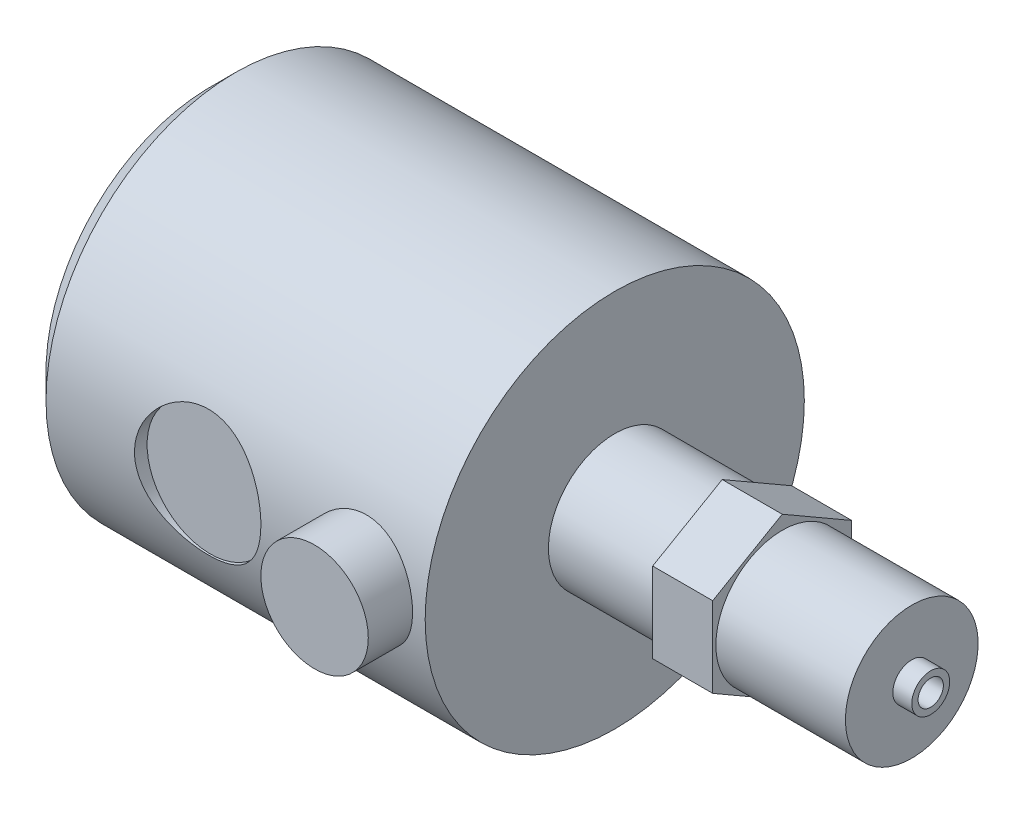
ISO-10303-21;
HEADER;
FILE_DESCRIPTION(('STEP AP214'),'2;1');
FILE_NAME('part.step','',(''),(''),'','','');
FILE_SCHEMA(('AUTOMOTIVE_DESIGN { 1 0 10303 214 1 1 1 1 }'));
ENDSEC;
DATA;
#1=APPLICATION_CONTEXT('core data for automotive mechanical design processes');
#2=APPLICATION_PROTOCOL_DEFINITION('international standard','automotive_design',2000,#1);
#3=PRODUCT_CONTEXT('',#1,'mechanical');
#4=PRODUCT('Part','Part','',(#3));
#5=PRODUCT_RELATED_PRODUCT_CATEGORY('part','',(#4));
#6=PRODUCT_DEFINITION_FORMATION('','',#4);
#7=PRODUCT_DEFINITION_CONTEXT('part definition',#1,'design');
#8=PRODUCT_DEFINITION('design','',#6,#7);
#9=PRODUCT_DEFINITION_SHAPE('','',#8);
#10=(LENGTH_UNIT() NAMED_UNIT(*) SI_UNIT(.MILLI.,.METRE.));
#11=(NAMED_UNIT(*) PLANE_ANGLE_UNIT() SI_UNIT($,.RADIAN.));
#12=(NAMED_UNIT(*) SI_UNIT($,.STERADIAN.) SOLID_ANGLE_UNIT());
#13=UNCERTAINTY_MEASURE_WITH_UNIT(LENGTH_MEASURE(1.E-05),#10,'distance_accuracy_value','');
#14=(GEOMETRIC_REPRESENTATION_CONTEXT(3) GLOBAL_UNCERTAINTY_ASSIGNED_CONTEXT((#13)) GLOBAL_UNIT_ASSIGNED_CONTEXT((#10,
#11,#12)) REPRESENTATION_CONTEXT('',''));
#15=CARTESIAN_POINT('',(0.,0.,0.));
#16=DIRECTION('',(0.,0.,1.));
#17=DIRECTION('',(1.,0.,0.));
#18=AXIS2_PLACEMENT_3D('',#15,#16,#17);
#19=CARTESIAN_POINT('',(0.,0.,0.));
#20=DIRECTION('',(-1.,0.,0.));
#21=DIRECTION('',(0.,0.,1.));
#22=AXIS2_PLACEMENT_3D('',#19,#20,#21);
#23=CYLINDRICAL_SURFACE('',#22,30.);
#24=CARTESIAN_POINT('',(38.,0.,30.));
#25=CARTESIAN_POINT('',(38.0000001104679,-0.272817421855649,30.0000000727974));
#26=CARTESIAN_POINT('',(37.9888266523667,-0.545633217756683,29.9962700139409));
#27=CARTESIAN_POINT('',(37.9442413958574,-1.08923625252841,29.9814525321439));
#28=CARTESIAN_POINT('',(37.9108297781762,-1.36002350786673,29.9703651689954));
#29=CARTESIAN_POINT('',(37.8220822374092,-1.89761112302447,29.9411347007489));
#30=CARTESIAN_POINT('',(37.7667446109079,-2.16441117140915,29.922991047455));
#31=CARTESIAN_POINT('',(37.6346518387313,-2.69211184449215,29.8801375011105));
#32=CARTESIAN_POINT('',(37.5578965476063,-2.95301242911357,29.8554275634677));
#33=CARTESIAN_POINT('',(37.3838026740723,-3.46664728525619,29.8001502927581));
#34=CARTESIAN_POINT('',(37.2865034902221,-3.71939613546444,29.769594181714));
#35=CARTESIAN_POINT('',(37.0719867410987,-4.2157054038381,29.7033758431392));
#36=CARTESIAN_POINT('',(36.9547618038682,-4.45926238037108,29.6677117265642));
#37=CARTESIAN_POINT('',(36.7013132201959,-4.93557741320288,29.5921987127881));
#38=CARTESIAN_POINT('',(36.5650906781184,-5.16833609617821,29.5523500588748));
#39=CARTESIAN_POINT('',(36.2745905228092,-5.62171195987547,29.4694667799179));
#40=CARTESIAN_POINT('',(36.1203118241659,-5.84232840951691,29.4264319634014));
#41=CARTESIAN_POINT('',(35.7896247247178,-6.27682953459762,29.3368734013662));
#42=CARTESIAN_POINT('',(35.6126759880062,-6.49028930660538,29.2902826885599));
#43=CARTESIAN_POINT('',(35.2417996008254,-6.90166928730258,29.1960870485027));
#44=CARTESIAN_POINT('',(35.0478716671758,-7.09958923671303,29.1484821043462));
#45=CARTESIAN_POINT('',(34.644187198448,-7.47873453607431,29.0535150777194));
#46=CARTESIAN_POINT('',(34.4344270648865,-7.65995606974809,29.0061530530903));
#47=CARTESIAN_POINT('',(34.0003833013844,-8.00450980543821,28.9129673550339));
#48=CARTESIAN_POINT('',(33.7761000429094,-8.16784246472039,28.8671436423059));
#49=CARTESIAN_POINT('',(33.307627620987,-8.48001162237398,28.7770145745701));
#50=CARTESIAN_POINT('',(33.0630494088315,-8.62828897719031,28.7327920322828));
#51=CARTESIAN_POINT('',(32.561607951453,-8.90356690608016,28.6486860707732));
#52=CARTESIAN_POINT('',(32.3047496061247,-9.0305758768566,28.6088009413422));
#53=CARTESIAN_POINT('',(31.7803993366107,-9.26232893823766,28.534611919855));
#54=CARTESIAN_POINT('',(31.5129077165079,-9.36707366499655,28.5003078683376));
#55=CARTESIAN_POINT('',(30.9692040524567,-9.55334459189202,28.4384115850147));
#56=CARTESIAN_POINT('',(30.692992401599,-9.63487183699472,28.4108190511471));
#57=CARTESIAN_POINT('',(30.1433639211935,-9.77156399073686,28.3640896180245));
#58=CARTESIAN_POINT('',(29.8701664913575,-9.82752458111659,28.3446991444855));
#59=CARTESIAN_POINT('',(29.319617177656,-9.91646893957756,28.3137046439995));
#60=CARTESIAN_POINT('',(29.042265380201,-9.94945318488936,28.3021004553276));
#61=CARTESIAN_POINT('',(28.4856273063419,-9.99210001297699,28.2870721491151));
#62=CARTESIAN_POINT('',(28.2063415667797,-10.001768826595,28.2836458461098));
#63=CARTESIAN_POINT('',(27.6479662400752,-9.99770051099412,28.2850842635986));
#64=CARTESIAN_POINT('',(27.3688766476204,-9.98396404222416,28.2899487501436));
#65=CARTESIAN_POINT('',(26.8258185571162,-9.93439524598055,28.3073918779751));
#66=CARTESIAN_POINT('',(26.5617426267179,-9.89960301642488,28.319607253905));
#67=CARTESIAN_POINT('',(26.0376215889632,-9.80916853998117,28.3510582066347));
#68=CARTESIAN_POINT('',(25.777576340707,-9.7535270236365,28.3702935374598));
#69=CARTESIAN_POINT('',(25.2632912481491,-9.62189570023088,28.4152063218622));
#70=CARTESIAN_POINT('',(25.009050859133,-9.54590781101341,28.4408831682495));
#71=CARTESIAN_POINT('',(24.5078880967364,-9.37418519909552,28.4979443617719));
#72=CARTESIAN_POINT('',(24.2609685440672,-9.27844297530628,28.529330876437));
#73=CARTESIAN_POINT('',(23.772237067919,-9.0663166164916,28.5974561704828));
#74=CARTESIAN_POINT('',(23.5305664167003,-8.94963170239518,28.6342713183779));
#75=CARTESIAN_POINT('',(23.0577897989686,-8.69749161241992,28.7118622802787));
#76=CARTESIAN_POINT('',(22.8266874781259,-8.56203002330162,28.7526394460964));
#77=CARTESIAN_POINT('',(22.3764378067254,-8.27327503440926,28.8370515032613));
#78=CARTESIAN_POINT('',(22.1572912822404,-8.11998040476689,28.8806865916162));
#79=CARTESIAN_POINT('',(21.7321864753289,-7.79652835236897,28.9696785669952));
#80=CARTESIAN_POINT('',(21.5262286466316,-7.62637034997736,29.0150355131707));
#81=CARTESIAN_POINT('',(21.1182174584067,-7.26085153575986,29.1087179470551));
#82=CARTESIAN_POINT('',(20.9169351310576,-7.06463704194718,29.1570743820817));
#83=CARTESIAN_POINT('',(20.531580418041,-6.65594240213112,29.2530762745549));
#84=CARTESIAN_POINT('',(20.3475026290649,-6.44346740133943,29.300721951247));
#85=CARTESIAN_POINT('',(19.997608072022,-6.00339730644672,29.3940440756636));
#86=CARTESIAN_POINT('',(19.8318000348253,-5.77579506581797,29.4397195755768));
#87=CARTESIAN_POINT('',(19.5197728737227,-5.30706897712641,29.5278149211553));
#88=CARTESIAN_POINT('',(19.3735459990738,-5.06595053306834,29.5702360521294));
#89=CARTESIAN_POINT('',(19.1003243634992,-4.56913058063748,29.6510879634885));
#90=CARTESIAN_POINT('',(18.9735405213375,-4.31330561219176,29.6894737298341));
#91=CARTESIAN_POINT('',(18.7420713564707,-3.79108523456436,29.7606637721347));
#92=CARTESIAN_POINT('',(18.6373863166824,-3.5246896901062,29.7934679766314));
#93=CARTESIAN_POINT('',(18.4510885271493,-2.98332200960532,29.8525359450835));
#94=CARTESIAN_POINT('',(18.3694692782669,-2.70835231375461,29.8788015511394));
#95=CARTESIAN_POINT('',(18.2300560036121,-2.15185145897869,29.92402797464));
#96=CARTESIAN_POINT('',(18.1722608812851,-1.87032060267474,29.9429891282845));
#97=CARTESIAN_POINT('',(18.0830583762764,-1.31523069421226,29.9723879768698));
#98=CARTESIAN_POINT('',(18.050615367746,-1.04185537514999,29.9831596368278));
#99=CARTESIAN_POINT('',(18.0083792858962,-0.493170936320485,29.9972012675858));
#100=CARTESIAN_POINT('',(17.9985855570884,-0.217861872748686,30.0004714554843));
#101=CARTESIAN_POINT('',(18.0017433831611,0.332568031007716,29.9994188985649));
#102=CARTESIAN_POINT('',(18.0146915114979,0.60768889330079,29.9950972976112));
#103=CARTESIAN_POINT('',(18.0631992209163,1.15570622136199,29.9789840848464));
#104=CARTESIAN_POINT('',(18.0987585736551,1.4286027095651,29.9671925484717));
#105=CARTESIAN_POINT('',(18.1907787821032,1.96222703239709,29.9369169558084));
#106=CARTESIAN_POINT('',(18.2465987120614,2.22307746287106,29.9186384657949));
#107=CARTESIAN_POINT('',(18.3787575509438,2.7390974709425,29.8758162932983));
#108=CARTESIAN_POINT('',(18.4551037635981,2.99426499136465,29.8512703808768));
#109=CARTESIAN_POINT('',(18.627646328962,3.4970874059583,29.7965488926633));
#110=CARTESIAN_POINT('',(18.7238370604955,3.74474440483059,29.7663749113147));
#111=CARTESIAN_POINT('',(18.9353702712062,4.2311771288961,29.7011345010077));
#112=CARTESIAN_POINT('',(19.050720116823,4.46994939463069,29.6660661910727));
#113=CARTESIAN_POINT('',(19.3029319865395,4.94315066961522,29.5909467676433));
#114=CARTESIAN_POINT('',(19.4402734803096,5.17730735950409,29.5507901885031));
#115=CARTESIAN_POINT('',(19.7332922577065,5.63338688490355,29.4672484943862));
#116=CARTESIAN_POINT('',(19.8889777330974,5.85530418930658,29.423861940227));
#117=CARTESIAN_POINT('',(20.2176166598181,6.28552190327163,29.3349700920827));
#118=CARTESIAN_POINT('',(20.3905708917514,6.49382169657323,29.2894647023692));
#119=CARTESIAN_POINT('',(20.7526733105245,6.89560723699441,29.1974842079415));
#120=CARTESIAN_POINT('',(20.941821920915,7.08909259640374,29.1510090778886));
#121=CARTESIAN_POINT('',(21.3441947029294,7.46861368298098,29.0561491129105));
#122=CARTESIAN_POINT('',(21.5581240383975,7.65390507082137,29.007774048611));
#123=CARTESIAN_POINT('',(22.001053721045,8.00578656049348,28.9126373623233));
#124=CARTESIAN_POINT('',(22.2300486419341,8.17238333784562,28.865875168565));
#125=CARTESIAN_POINT('',(22.7018574573737,8.48586679285762,28.7752794226618));
#126=CARTESIAN_POINT('',(22.9446772903351,8.63274490811907,28.7314471468913));
#127=CARTESIAN_POINT('',(23.4423930021589,8.90554413202635,28.6480650290242));
#128=CARTESIAN_POINT('',(23.6972837746505,9.03147400245094,28.6085133989423));
#129=CARTESIAN_POINT('',(24.2170782306002,9.26121465963452,28.5349686573375));
#130=CARTESIAN_POINT('',(24.4819633305474,9.36506432595329,28.5009658003202));
#131=CARTESIAN_POINT('',(25.0203169958056,9.54999948685703,28.4395326253181));
#132=CARTESIAN_POINT('',(25.2937855900695,9.63108490464717,28.4121023295056));
#133=CARTESIAN_POINT('',(25.8471667717795,9.76967941183168,28.364744570705));
#134=CARTESIAN_POINT('',(26.1270768867932,9.82719739275427,28.3448142783458));
#135=CARTESIAN_POINT('',(26.691242348877,9.91810350429491,28.3131339062987));
#136=CARTESIAN_POINT('',(26.9754974762297,9.95149285094855,28.301383414366));
#137=CARTESIAN_POINT('',(27.5313663836579,9.99269827789952,28.2868595572535));
#138=CARTESIAN_POINT('',(27.8028786926903,10.0017409386727,28.2836556970276));
#139=CARTESIAN_POINT('',(28.3457124952811,9.99770707019235,28.2850819532403));
#140=CARTESIAN_POINT('',(28.6170339953448,9.98463133564126,28.2897117882182));
#141=CARTESIAN_POINT('',(29.1574554852446,9.9364928064115,28.3066557004955));
#142=CARTESIAN_POINT('',(29.426555612442,9.9014313817203,28.3189692989986));
#143=CARTESIAN_POINT('',(29.9605963770422,9.80966197710057,28.3508886380516));
#144=CARTESIAN_POINT('',(30.2255370011434,9.75295392796379,28.3704944019159));
#145=CARTESIAN_POINT('',(30.7443545709811,9.61971250162803,28.4159458608578));
#146=CARTESIAN_POINT('',(30.9983463096881,9.54358162889864,28.441664218809));
#147=CARTESIAN_POINT('',(31.4990030549066,9.3716093890319,28.498791950436));
#148=CARTESIAN_POINT('',(31.7456654257493,9.2757610272738,28.5302033431982));
#149=CARTESIAN_POINT('',(32.23006103195,9.0651164728258,28.597830166649));
#150=CARTESIAN_POINT('',(32.4677945733622,8.95032093031891,28.6340454324816));
#151=CARTESIAN_POINT('',(32.9329845529021,8.70259247852741,28.7103060608169));
#152=CARTESIAN_POINT('',(33.160440289649,8.56965833390418,28.7503516841324));
#153=CARTESIAN_POINT('',(33.6134815254137,8.28034879297643,28.8350396975525));
#154=CARTESIAN_POINT('',(33.8385525409484,8.12320375674414,28.8798064098721));
#155=CARTESIAN_POINT('',(34.274796355551,7.791153864974,28.9711505527338));
#156=CARTESIAN_POINT('',(34.4859688258691,7.61624858959245,29.0177280260653));
#157=CARTESIAN_POINT('',(34.8932342213525,7.24971676169647,29.1114649338633));
#158=CARTESIAN_POINT('',(35.0893230431879,7.05808568917761,29.1586245226669));
#159=CARTESIAN_POINT('',(35.4651796743633,6.65929199916924,29.2522781356485));
#160=CARTESIAN_POINT('',(35.6449476900323,6.45212957808884,29.2987721682343));
#161=CARTESIAN_POINT('',(35.9937657443444,6.015057656916,29.3916811895353));
#162=CARTESIAN_POINT('',(36.1621176990621,5.78457436071791,29.4380213798086));
#163=CARTESIAN_POINT('',(36.4787090683785,5.30969823861295,29.5273677523704));
#164=CARTESIAN_POINT('',(36.6269560178353,5.06531067269805,29.5703751810909));
#165=CARTESIAN_POINT('',(36.9022628234117,4.56414864864736,29.6518631526816));
#166=CARTESIAN_POINT('',(37.0293225855371,4.30737413556508,29.6903436754686));
#167=CARTESIAN_POINT('',(37.2611782059596,3.78321180102571,29.7616741137116));
#168=CARTESIAN_POINT('',(37.3659752171987,3.51582453003312,29.7945243207331));
#169=CARTESIAN_POINT('',(37.5481922470328,2.98451649561972,29.8523172984574));
#170=CARTESIAN_POINT('',(37.6266261591357,2.72097451656309,29.877547765761));
#171=CARTESIAN_POINT('',(37.761615917993,2.1878001940133,29.9213145214249));
#172=CARTESIAN_POINT('',(37.8181724828281,1.91816805072525,29.9398510294998));
#173=CARTESIAN_POINT('',(37.9088695791786,1.37482625392579,29.9697157235778));
#174=CARTESIAN_POINT('',(37.9430152864708,1.10111755683676,29.9810455739363));
#175=CARTESIAN_POINT('',(37.9885804097446,0.551605348742875,29.9961876649972));
#176=CARTESIAN_POINT('',(37.9999998883236,0.275801843510097,29.9999999264062));
#177=CARTESIAN_POINT('',(38.,0.,30.));
#178=B_SPLINE_CURVE_WITH_KNOTS('',3,(#24,#25,#26,#27,#28,#29,#30,#31,#32,#33,#34,#35,#36,#37,
#38,#39,#40,#41,#42,#43,#44,#45,#46,#47,#48,#49,#50,#51,#52,#53,#54,#55,#56,#57,#58,#59,#60,#61,
#62,#63,#64,#65,#66,#67,#68,#69,#70,#71,#72,#73,#74,#75,#76,#77,#78,#79,#80,#81,#82,#83,#84,#85,
#86,#87,#88,#89,#90,#91,#92,#93,#94,#95,#96,#97,#98,#99,#100,#101,#102,#103,#104,#105,#106,#107,
#108,#109,#110,#111,#112,#113,#114,#115,#116,#117,#118,#119,#120,#121,#122,#123,#124,#125,#126,
#127,#128,#129,#130,#131,#132,#133,#134,#135,#136,#137,#138,#139,#140,#141,#142,#143,#144,#145,
#146,#147,#148,#149,#150,#151,#152,#153,#154,#155,#156,#157,#158,#159,#160,#161,#162,#163,#164,
#165,#166,#167,#168,#169,#170,#171,#172,#173,#174,#175,#176,#177),.UNSPECIFIED.,.T.,.F.,(4,2,2,
2,2,2,2,2,2,2,2,2,2,2,2,2,2,2,2,2,2,2,2,2,2,2,2,2,2,2,2,2,2,2,2,2,2,2,2,2,2,2,2,2,2,2,2,2,2,2,2,
2,2,2,2,2,2,2,2,2,2,2,2,2,2,2,2,2,2,2,2,2,2,2,2,2,4),(0.,0.818196432007471,1.6363862147065,
2.45463957443219,3.27289849113841,4.08960219775423,4.90660872161766,5.72356777122699,
6.54057595602183,7.38307938747213,8.22559687294596,9.06830643331703,9.91099444776757,
10.7781693377685,11.645001058067,12.5118080071298,13.3785759370123,14.2161395744967,
15.0536858148335,15.8910082035541,16.7283069651494,17.5272827763208,18.3262305945964,
19.1251031307667,19.9242795738385,20.7360167087683,21.5480317816989,22.3601028890635,
23.1722019190185,24.0268844717706,24.881297691995,25.7361174700155,26.590597881189,
27.453776210577,28.3169655900159,29.1799115096585,30.0428177059962,30.8683037091444,
31.6937658217619,32.5191035716477,33.3444329868686,34.1456526351705,34.9471577542856,
35.7484361493029,36.5500233420392,37.3723552433202,38.1950557703192,39.0177935028915,
39.8405527600735,40.7009055318267,41.5609501023284,42.4213669287557,43.2814229688245,
44.1399518163629,44.998483560099,45.8566910978631,46.7148553806428,47.5288973096875,
48.3429099912533,49.1568719545403,49.9708365202357,50.7691377037427,51.5677225680383,
52.3662800341472,53.1648919135846,53.9983437551269,54.831815303668,55.665512792355,
56.4991997398996,57.3656243250608,58.2317232930636,59.0978261032941,59.9638840489003,
60.7912515257116,61.618591843516,62.4457410201728,63.2728879185129),.UNSPECIFIED.);
#179=CARTESIAN_POINT('',(38.,0.,30.));
#180=VERTEX_POINT('',#179);
#181=EDGE_CURVE('E200',#180,#180,#178,.T.);
#182=ORIENTED_EDGE('',*,*,#181,.T.);
#183=EDGE_LOOP('',(#182));
#184=FACE_BOUND('',#183,.T.);
#185=CARTESIAN_POINT('',(4.,0.,0.));
#186=DIRECTION('',(1.,0.,0.));
#187=DIRECTION('',(0.,0.,-1.));
#188=AXIS2_PLACEMENT_3D('',#185,#186,#187);
#189=CIRCLE('',#188,30.);
#190=CARTESIAN_POINT('',(4.,0.,-30.));
#191=VERTEX_POINT('',#190);
#192=EDGE_CURVE('E196',#191,#191,#189,.T.);
#193=ORIENTED_EDGE('',*,*,#192,.T.);
#194=EDGE_LOOP('',(#193));
#195=FACE_BOUND('',#194,.T.);
#196=CARTESIAN_POINT('',(64.,0.,0.));
#197=DIRECTION('',(-1.,0.,0.));
#198=DIRECTION('',(0.,0.,1.));
#199=AXIS2_PLACEMENT_3D('',#196,#197,#198);
#200=CIRCLE('',#199,30.);
#201=CARTESIAN_POINT('',(64.,0.,30.));
#202=VERTEX_POINT('',#201);
#203=EDGE_CURVE('E188',#202,#202,#200,.T.);
#204=ORIENTED_EDGE('',*,*,#203,.T.);
#205=EDGE_LOOP('',(#204));
#206=FACE_BOUND('',#205,.T.);
#207=CARTESIAN_POINT('',(62.,0.,30.));
#208=CARTESIAN_POINT('',(61.9999993344949,0.233748587422773,29.9999995900858));
#209=CARTESIAN_POINT('',(61.9903499084238,0.467509424920999,29.9972614671807));
#210=CARTESIAN_POINT('',(61.9518360339255,0.933324432470025,29.9863835079776));
#211=CARTESIAN_POINT('',(61.9229702397293,1.16537848183945,29.9782432933582));
#212=CARTESIAN_POINT('',(61.846273048913,1.62612282188995,29.9567841989898));
#213=CARTESIAN_POINT('',(61.7984387669903,1.85481259533896,29.9434645313987));
#214=CARTESIAN_POINT('',(61.6841952586361,2.3072512660602,29.9120049298404));
#215=CARTESIAN_POINT('',(61.6177791677971,2.53099830438937,29.8938632146583));
#216=CARTESIAN_POINT('',(61.4670639054162,2.97153052123142,29.8532888233965));
#217=CARTESIAN_POINT('',(61.3827968523434,3.1883274088419,29.8308638610129));
#218=CARTESIAN_POINT('',(61.19693510253,3.61402161361748,29.782289450892));
#219=CARTESIAN_POINT('',(61.0953338974453,3.82291592752957,29.7561386048312));
#220=CARTESIAN_POINT('',(60.8756178887974,4.23131293812697,29.7008155501961));
#221=CARTESIAN_POINT('',(60.7575088370121,4.43081887375022,29.6716443948926));
#222=CARTESIAN_POINT('',(60.5055207220629,4.81936965462472,29.6110175916001));
#223=CARTESIAN_POINT('',(60.3716344378557,5.0084096511119,29.5795609000949));
#224=CARTESIAN_POINT('',(60.0857265573808,5.37905703066696,29.5144367215656));
#225=CARTESIAN_POINT('',(59.9333550134779,5.56038849614643,29.4807347954965));
#226=CARTESIAN_POINT('',(59.6141531162765,5.90957400345355,29.4127280018086));
#227=CARTESIAN_POINT('',(59.447328921414,6.07743372757375,29.3784233959178));
#228=CARTESIAN_POINT('',(59.1001388078357,6.39878320937184,29.3101105010805));
#229=CARTESIAN_POINT('',(58.9197654940547,6.55226501542598,29.2761023854249));
#230=CARTESIAN_POINT('',(58.5467672868505,6.84369301502616,29.2093514338516));
#231=CARTESIAN_POINT('',(58.354146986227,6.98164497934431,29.1766081309298));
#232=CARTESIAN_POINT('',(57.953808101492,7.2437546550627,29.1126534256254));
#233=CARTESIAN_POINT('',(57.7458633825754,7.36757810352304,29.0814862293383));
#234=CARTESIAN_POINT('',(57.319897960421,7.59716359046006,29.0223562084451));
#235=CARTESIAN_POINT('',(57.1018812164148,7.70293265048977,28.9943921395053));
#236=CARTESIAN_POINT('',(56.6571908575439,7.89562320250351,28.9425136745065));
#237=CARTESIAN_POINT('',(56.430516908715,7.98254396652176,28.9185994348693));
#238=CARTESIAN_POINT('',(55.9701518758144,8.13678532101803,28.8755804046432));
#239=CARTESIAN_POINT('',(55.7364610124879,8.20410652736813,28.8564754629354));
#240=CARTESIAN_POINT('',(55.269776774924,8.31709489366217,28.8241097087492));
#241=CARTESIAN_POINT('',(55.0369147121457,8.36326578257398,28.8107135431348));
#242=CARTESIAN_POINT('',(54.5678941887626,8.4359892779895,28.789503725662));
#243=CARTESIAN_POINT('',(54.3317357788757,8.46254218599961,28.781689988008));
#244=CARTESIAN_POINT('',(53.8579479209355,8.49577885990828,28.7718967577667));
#245=CARTESIAN_POINT('',(53.6203187538816,8.50246631056149,28.7699161832127));
#246=CARTESIAN_POINT('',(53.14536157742,8.49591873899428,28.7718504364515));
#247=CARTESIAN_POINT('',(52.9080335624532,8.48268409004222,28.7757651537878));
#248=CARTESIAN_POINT('',(52.4430662681597,8.43716182559631,28.7891444293727));
#249=CARTESIAN_POINT('',(52.2153602821544,8.40549857253084,28.7984270589812));
#250=CARTESIAN_POINT('',(51.7634372763284,8.32388682603364,28.8221219161467));
#251=CARTESIAN_POINT('',(51.5392215345014,8.27393179174377,28.8365359785735));
#252=CARTESIAN_POINT('',(51.095965879904,8.15617505806777,28.8700632013093));
#253=CARTESIAN_POINT('',(50.8769243904541,8.08837887365847,28.8891749093829));
#254=CARTESIAN_POINT('',(50.4453078436405,7.93544567622747,28.9315570714365));
#255=CARTESIAN_POINT('',(50.2327352570186,7.85030213074817,28.9548290916505));
#256=CARTESIAN_POINT('',(49.8129632680185,7.66219923662893,29.0051769691177));
#257=CARTESIAN_POINT('',(49.6058600800502,7.559036668617,29.0322954689949));
#258=CARTESIAN_POINT('',(49.2009762278384,7.33633404587884,29.0893694355853));
#259=CARTESIAN_POINT('',(49.0031987964307,7.21678836712787,29.1193258754169));
#260=CARTESIAN_POINT('',(48.6182430091557,6.96216244717103,29.181251770569));
#261=CARTESIAN_POINT('',(48.4310647842663,6.82708201405944,29.213221250755));
#262=CARTESIAN_POINT('',(48.0684285474282,6.54226201281915,29.2783220721552));
#263=CARTESIAN_POINT('',(47.8929708303915,6.39252207606069,29.311453442573));
#264=CARTESIAN_POINT('',(47.5485268006956,6.07347553485702,29.3792522825637));
#265=CARTESIAN_POINT('',(47.3800249424109,5.90364787310304,29.4139310030348));
#266=CARTESIAN_POINT('',(47.0579243843003,5.5503856036617,29.4826318603736));
#267=CARTESIAN_POINT('',(46.904320842674,5.36695545107287,29.5166542076569));
#268=CARTESIAN_POINT('',(46.6129309042918,4.98753630634584,29.5831300598804));
#269=CARTESIAN_POINT('',(46.4751513029567,4.79154197453478,29.6155828873697));
#270=CARTESIAN_POINT('',(46.2165172187545,4.38841719296539,29.6779947555445));
#271=CARTESIAN_POINT('',(46.0956561299051,4.18129113365288,29.707954767708));
#272=CARTESIAN_POINT('',(45.8710465618963,3.75596116106109,29.764728268146));
#273=CARTESIAN_POINT('',(45.7674026220067,3.53769939328006,29.7915222683896));
#274=CARTESIAN_POINT('',(45.5789695830152,3.09283126930056,29.8409861741362));
#275=CARTESIAN_POINT('',(45.4941729215231,2.86622830266864,29.8636577330844));
#276=CARTESIAN_POINT('',(45.3441059177286,2.40622550224812,29.9042369172559));
#277=CARTESIAN_POINT('',(45.278835644312,2.17282564448437,29.9221445256725));
#278=CARTESIAN_POINT('',(45.1684106844416,1.70097686717856,29.9526720009894));
#279=CARTESIAN_POINT('',(45.1232553491585,1.46252811075417,29.9652920384451));
#280=CARTESIAN_POINT('',(45.0546080040065,0.990180574815758,29.9845560015487));
#281=CARTESIAN_POINT('',(45.0304629220606,0.756383866873988,29.9913799149994));
#282=CARTESIAN_POINT('',(45.001617168334,0.287500198219745,29.9995386148822));
#283=CARTESIAN_POINT('',(44.9969160773827,0.0524132654311508,30.0008735196454));
#284=CARTESIAN_POINT('',(45.0069999392418,-0.417282050608856,29.9980170598488));
#285=CARTESIAN_POINT('',(45.0217828029015,-0.651890482465809,29.9938262877749));
#286=CARTESIAN_POINT('',(45.0706971653826,-1.11891904346736,29.9800366328582));
#287=CARTESIAN_POINT('',(45.1048285509214,-1.35133918541594,29.9704377816787));
#288=CARTESIAN_POINT('',(45.191261991498,-1.80768450477174,29.9463427580953));
#289=CARTESIAN_POINT('',(45.2431871204592,-2.03168661914196,29.9319483338451));
#290=CARTESIAN_POINT('',(45.3649199456942,-2.4745142255189,29.8985969917367));
#291=CARTESIAN_POINT('',(45.4347340646222,-2.69333782740572,29.8796384353738));
#292=CARTESIAN_POINT('',(45.5916601000517,-3.12421463236981,29.8376629387433));
#293=CARTESIAN_POINT('',(45.6787671033189,-3.33626973868524,29.8146471514191));
#294=CARTESIAN_POINT('',(45.8696707328346,-3.75239915653624,29.7651377869811));
#295=CARTESIAN_POINT('',(45.9734736362253,-3.95647043038019,29.738642902525));
#296=CARTESIAN_POINT('',(46.1993598671451,-4.35948752893025,29.6822697569169));
#297=CARTESIAN_POINT('',(46.3217817553428,-4.55823528184279,29.6523320558981));
#298=CARTESIAN_POINT('',(46.5824158177423,-4.94483548237364,29.5903185099076));
#299=CARTESIAN_POINT('',(46.7206334548764,-5.13268412648332,29.5582419268145));
#300=CARTESIAN_POINT('',(47.0119095557758,-5.4962661996949,29.4927988344012));
#301=CARTESIAN_POINT('',(47.1649684305951,-5.67199929300477,29.4594322893688));
#302=CARTESIAN_POINT('',(47.4849487037255,-6.01027159971704,29.3922843108564));
#303=CARTESIAN_POINT('',(47.6518703280941,-6.17281059788017,29.3585028706185));
#304=CARTESIAN_POINT('',(48.0041575993242,-6.48871988458401,29.2903306442492));
#305=CARTESIAN_POINT('',(48.1899452709306,-6.64162334139769,29.255955508686));
#306=CARTESIAN_POINT('',(48.5739198597895,-6.93120034949857,29.1887059845363));
#307=CARTESIAN_POINT('',(48.7721025327113,-7.06787941043174,29.1558310888311));
#308=CARTESIAN_POINT('',(49.1797070585775,-7.3241409596969,29.0925143791163));
#309=CARTESIAN_POINT('',(49.3891330123431,-7.4437171509377,29.0620734630814));
#310=CARTESIAN_POINT('',(49.8176719680677,-7.66476097884569,29.0045597147074));
#311=CARTESIAN_POINT('',(50.0367809769038,-7.76623599476031,28.9774855112413));
#312=CARTESIAN_POINT('',(50.4821271168591,-7.94985286995606,28.9276485526093));
#313=CARTESIAN_POINT('',(50.70832272887,-8.03208964494388,28.9048647435121));
#314=CARTESIAN_POINT('',(51.1671892007781,-8.17715531057056,28.8641613689036));
#315=CARTESIAN_POINT('',(51.3998575067036,-8.23999174096912,28.8462399140135));
#316=CARTESIAN_POINT('',(51.8700196411889,-8.34573053780008,28.8158257486988));
#317=CARTESIAN_POINT('',(52.1075132061961,-8.38863398992097,28.8033327426054));
#318=CARTESIAN_POINT('',(52.5855178648231,-8.45410611853674,28.7841841828837));
#319=CARTESIAN_POINT('',(52.826028858948,-8.47667546373905,28.7775284372914));
#320=CARTESIAN_POINT('',(53.2992244974588,-8.50080663404737,28.7704089910883));
#321=CARTESIAN_POINT('',(53.5318679268864,-8.50311779629233,28.7697244251778));
#322=CARTESIAN_POINT('',(53.9965089186426,-8.48866898171225,28.7739909754797));
#323=CARTESIAN_POINT('',(54.2285064888031,-8.47190923716372,28.7789420230523));
#324=CARTESIAN_POINT('',(54.6901558713892,-8.41947124956688,28.794326646121));
#325=CARTESIAN_POINT('',(54.9198077896648,-8.38379386407618,28.804759973099));
#326=CARTESIAN_POINT('',(55.3751386869438,-8.29383569519572,28.8307904475091));
#327=CARTESIAN_POINT('',(55.6008176462238,-8.23955481947823,28.846387620569));
#328=CARTESIAN_POINT('',(56.0443870883088,-8.11349010703554,28.8820968754878));
#329=CARTESIAN_POINT('',(56.2623331444534,-8.04188819203561,28.9021618683717));
#330=CARTESIAN_POINT('',(56.6914425693784,-7.88144546509532,28.9463251061939));
#331=CARTESIAN_POINT('',(56.9026036292213,-7.79259885569816,28.970424707143));
#332=CARTESIAN_POINT('',(57.3167235987409,-7.59835025007517,29.0219772589756));
#333=CARTESIAN_POINT('',(57.5196829489782,-7.49294914457596,29.0494300294218));
#334=CARTESIAN_POINT('',(57.9161864109168,-7.26632279354066,29.1069444437402));
#335=CARTESIAN_POINT('',(58.1097299988553,-7.14509666909816,29.1370062324837));
#336=CARTESIAN_POINT('',(58.4924400048941,-6.88338818610279,29.199960017187));
#337=CARTESIAN_POINT('',(58.681253276137,-6.74240374828142,29.2329125700614));
#338=CARTESIAN_POINT('',(59.0464243790789,-6.44535315446317,29.2998395254541));
#339=CARTESIAN_POINT('',(59.2227819866288,-6.28928672717402,29.3338139463462));
#340=CARTESIAN_POINT('',(59.5619799456577,-5.9630349386258,29.4018703843625));
#341=CARTESIAN_POINT('',(59.7248169095998,-5.79284606027629,29.4359524262438));
#342=CARTESIAN_POINT('',(60.0358792911672,-5.43945701931171,29.5032990750427));
#343=CARTESIAN_POINT('',(60.1841049733526,-5.25625709238517,29.5365636967528));
#344=CARTESIAN_POINT('',(60.4685297605894,-4.87318515879017,29.6022088881834));
#345=CARTESIAN_POINT('',(60.6043286824107,-4.67300822200851,29.6345456631803));
#346=CARTESIAN_POINT('',(60.8584926473674,-4.26157622226824,29.6965018652551));
#347=CARTESIAN_POINT('',(60.9768640445473,-4.0503252351732,29.7261222812197));
#348=CARTESIAN_POINT('',(61.1952832082098,-3.61817838351508,29.7818104037794));
#349=CARTESIAN_POINT('',(61.2953361891621,-3.39728528589032,29.8078791208489));
#350=CARTESIAN_POINT('',(61.4763279969693,-2.94736669851144,29.8557227751365));
#351=CARTESIAN_POINT('',(61.5572690444826,-2.71834215712878,29.877498211152));
#352=CARTESIAN_POINT('',(61.6896791926513,-2.28543236580436,29.9134980784956));
#353=CARTESIAN_POINT('',(61.7436591031046,-2.08236276912876,29.9283466248059));
#354=CARTESIAN_POINT('',(61.8364693489263,-1.67254608664531,29.9540436037644));
#355=CARTESIAN_POINT('',(61.8753006601149,-1.46579923861063,29.964892294067));
#356=CARTESIAN_POINT('',(61.9375439160721,-1.04980352360716,29.9823490331439));
#357=CARTESIAN_POINT('',(61.960954743449,-0.840554476443545,29.9889567746118));
#358=CARTESIAN_POINT('',(61.9921806560791,-0.420873336514294,29.9977817587777));
#359=CARTESIAN_POINT('',(62.0000005991479,-0.210441632741009,30.0000003690418));
#360=CARTESIAN_POINT('',(62.,0.,30.));
#361=B_SPLINE_CURVE_WITH_KNOTS('',3,(#207,#208,#209,#210,#211,#212,#213,#214,#215,#216,#217,
#218,#219,#220,#221,#222,#223,#224,#225,#226,#227,#228,#229,#230,#231,#232,#233,#234,#235,#236,
#237,#238,#239,#240,#241,#242,#243,#244,#245,#246,#247,#248,#249,#250,#251,#252,#253,#254,#255,
#256,#257,#258,#259,#260,#261,#262,#263,#264,#265,#266,#267,#268,#269,#270,#271,#272,#273,#274,
#275,#276,#277,#278,#279,#280,#281,#282,#283,#284,#285,#286,#287,#288,#289,#290,#291,#292,#293,
#294,#295,#296,#297,#298,#299,#300,#301,#302,#303,#304,#305,#306,#307,#308,#309,#310,#311,#312,
#313,#314,#315,#316,#317,#318,#319,#320,#321,#322,#323,#324,#325,#326,#327,#328,#329,#330,#331,
#332,#333,#334,#335,#336,#337,#338,#339,#340,#341,#342,#343,#344,#345,#346,#347,#348,#349,#350,
#351,#352,#353,#354,#355,#356,#357,#358,#359,#360),.UNSPECIFIED.,.T.,.F.,(4,2,2,2,2,2,2,2,2,2,2,
2,2,2,2,2,2,2,2,2,2,2,2,2,2,2,2,2,2,2,2,2,2,2,2,2,2,2,2,2,2,2,2,2,2,2,2,2,2,2,2,2,2,2,2,2,2,2,2,
2,2,2,2,2,2,2,2,2,2,2,2,2,2,2,2,2,4),(0.,0.701052704606102,1.40215451080288,2.1033630027466,
2.80483087476205,3.5050471858835,4.20552698370008,4.90576332113107,5.60632140198368,
6.32320722052643,7.03978905451774,7.75676487876862,8.47347339459581,9.20463458960728,
9.9355107767776,10.6664151870892,11.3972966278917,12.1097278857312,12.8221481940722,
13.5344363505099,14.2467111614009,14.936153263113,15.6258421398026,16.3153180728551,
17.0050541218131,17.7031409687314,18.4014680592922,19.0998037774344,19.798157060529,
20.5225217168277,21.2466501676449,21.971088433975,22.6952430432505,23.4236454604766,
24.1517550795897,24.8798672673263,25.6079559673112,26.3125096604853,27.0170481649165,
27.7215111319422,28.4259699744934,29.1163446838393,29.8069676054092,30.4973945880937,
31.1880817593662,31.8932956362695,32.598754152505,33.3042322132256,34.0097217803122,
34.7380383518924,35.4661068824146,36.1944427935918,36.9224811044609,37.6468479461587,
38.3709329141579,39.0949784388332,39.8190001516787,40.5161223518658,41.2132360614559,
41.910318172811,42.6074037437826,43.2974635695369,43.9877557881092,44.6780108777255,
45.3683043197712,46.0812940703625,46.7942966484801,47.5074773305419,48.2206450969914,
48.9518937224486,49.6828750721835,50.4136480181747,51.1443360121952,51.7756787844343,
52.4069808810426,53.0383287177286,53.6694798079723),.UNSPECIFIED.);
#362=CARTESIAN_POINT('',(62.,0.,30.));
#363=VERTEX_POINT('',#362);
#364=EDGE_CURVE('E11',#363,#363,#361,.T.);
#365=ORIENTED_EDGE('',*,*,#364,.F.);
#366=EDGE_LOOP('',(#365));
#367=FACE_BOUND('',#366,.T.);
#368=ADVANCED_FACE('F47',(#184,#195,#206,#367),#23,.T.);
#369=CARTESIAN_POINT('',(0.,0.,0.));
#370=DIRECTION('',(-1.,0.,0.));
#371=DIRECTION('',(0.,0.,1.));
#372=AXIS2_PLACEMENT_3D('',#369,#370,#371);
#373=CYLINDRICAL_SURFACE('',#372,10.5);
#374=CARTESIAN_POINT('',(64.,0.,0.));
#375=DIRECTION('',(-1.,0.,0.));
#376=DIRECTION('',(0.,0.,1.));
#377=AXIS2_PLACEMENT_3D('',#374,#375,#376);
#378=CIRCLE('',#377,10.5);
#379=CARTESIAN_POINT('',(64.,0.,10.5));
#380=VERTEX_POINT('',#379);
#381=EDGE_CURVE('E184',#380,#380,#378,.T.);
#382=ORIENTED_EDGE('',*,*,#381,.F.);
#383=EDGE_LOOP('',(#382));
#384=FACE_BOUND('',#383,.T.);
#385=CARTESIAN_POINT('',(81.,0.,0.));
#386=DIRECTION('',(1.,0.,0.));
#387=DIRECTION('',(0.,0.,-1.));
#388=AXIS2_PLACEMENT_3D('',#385,#386,#387);
#389=CIRCLE('',#388,10.5);
#390=CARTESIAN_POINT('',(81.,0.,-10.5));
#391=VERTEX_POINT('',#390);
#392=EDGE_CURVE('E208',#391,#391,#389,.T.);
#393=ORIENTED_EDGE('',*,*,#392,.F.);
#394=EDGE_LOOP('',(#393));
#395=FACE_BOUND('',#394,.T.);
#396=ADVANCED_FACE('F230',(#384,#395),#373,.T.);
#397=CARTESIAN_POINT('',(0.,0.,0.));
#398=DIRECTION('',(1.,0.,0.));
#399=DIRECTION('',(0.,0.,-1.));
#400=AXIS2_PLACEMENT_3D('',#397,#398,#399);
#401=PLANE('',#400);
#402=CARTESIAN_POINT('',(0.,0.,0.));
#403=DIRECTION('',(1.,0.,0.));
#404=DIRECTION('',(0.,0.,-1.));
#405=AXIS2_PLACEMENT_3D('',#402,#403,#404);
#406=CIRCLE('',#405,26.);
#407=CARTESIAN_POINT('',(0.,0.,-26.));
#408=VERTEX_POINT('',#407);
#409=EDGE_CURVE('E192',#408,#408,#406,.F.);
#410=ORIENTED_EDGE('',*,*,#409,.T.);
#411=EDGE_LOOP('',(#410));
#412=FACE_BOUND('',#411,.T.);
#413=ADVANCED_FACE('F233',(#412),#401,.F.);
#414=CARTESIAN_POINT('',(64.,30.,0.));
#415=DIRECTION('',(-1.,0.,0.));
#416=DIRECTION('',(0.,0.,1.));
#417=AXIS2_PLACEMENT_3D('',#414,#415,#416);
#418=PLANE('',#417);
#419=ORIENTED_EDGE('',*,*,#203,.F.);
#420=EDGE_LOOP('',(#419));
#421=FACE_BOUND('',#420,.T.);
#422=ORIENTED_EDGE('',*,*,#381,.T.);
#423=EDGE_LOOP('',(#422));
#424=FACE_BOUND('',#423,.T.);
#425=ADVANCED_FACE('F231',(#421,#424),#418,.F.);
#426=CARTESIAN_POINT('',(0.,0.,0.));
#427=DIRECTION('',(1.,0.,0.));
#428=DIRECTION('',(0.,0.,-1.));
#429=AXIS2_PLACEMENT_3D('',#426,#427,#428);
#430=CONICAL_SURFACE('',#429,26.,0.785398163397448);
#431=ORIENTED_EDGE('',*,*,#192,.F.);
#432=EDGE_LOOP('',(#431));
#433=FACE_BOUND('',#432,.T.);
#434=ORIENTED_EDGE('',*,*,#409,.F.);
#435=EDGE_LOOP('',(#434));
#436=FACE_BOUND('',#435,.T.);
#437=ADVANCED_FACE('F50',(#433,#436),#430,.T.);
#438=CARTESIAN_POINT('',(28.,0.,28.));
#439=DIRECTION('',(0.,0.,1.));
#440=DIRECTION('',(1.,0.,0.));
#441=AXIS2_PLACEMENT_3D('',#438,#439,#440);
#442=CYLINDRICAL_SURFACE('',#441,10.);
#443=CARTESIAN_POINT('',(28.,0.,28.));
#444=DIRECTION('',(0.,0.,1.));
#445=DIRECTION('',(1.,0.,0.));
#446=AXIS2_PLACEMENT_3D('',#443,#444,#445);
#447=CIRCLE('',#446,10.);
#448=CARTESIAN_POINT('',(38.,0.,28.));
#449=VERTEX_POINT('',#448);
#450=EDGE_CURVE('E176',#449,#449,#447,.T.);
#451=ORIENTED_EDGE('',*,*,#450,.F.);
#452=EDGE_LOOP('',(#451));
#453=FACE_BOUND('',#452,.T.);
#454=ORIENTED_EDGE('',*,*,#181,.F.);
#455=EDGE_LOOP('',(#454));
#456=FACE_BOUND('',#455,.T.);
#457=ADVANCED_FACE('F212',(#453,#456),#442,.F.);
#458=CARTESIAN_POINT('',(28.,0.,28.));
#459=DIRECTION('',(0.,0.,1.));
#460=DIRECTION('',(1.,0.,0.));
#461=AXIS2_PLACEMENT_3D('',#458,#459,#460);
#462=PLANE('',#461);
#463=ORIENTED_EDGE('',*,*,#450,.T.);
#464=EDGE_LOOP('',(#463));
#465=FACE_BOUND('',#464,.T.);
#466=ADVANCED_FACE('F217',(#465),#462,.T.);
#467=CARTESIAN_POINT('',(90.5,6.35085296108588,-11.));
#468=DIRECTION('',(0.,-0.866025403784439,0.5));
#469=DIRECTION('',(0.,-0.5,-0.866025403784439));
#470=AXIS2_PLACEMENT_3D('',#467,#468,#469);
#471=PLANE('',#470);
#472=DIRECTION('',(0.,0.5,0.866025403784438));
#473=VECTOR('',#472,1.);
#474=CARTESIAN_POINT('',(81.,6.35085296108588,-11.));
#475=LINE('',#474,#473);
#476=CARTESIAN_POINT('',(81.,6.35085296108588,-11.));
#477=VERTEX_POINT('',#476);
#478=CARTESIAN_POINT('',(81.,12.7017059221718,0.));
#479=VERTEX_POINT('',#478);
#480=EDGE_CURVE('E144',#477,#479,#475,.T.);
#481=ORIENTED_EDGE('',*,*,#480,.T.);
#482=DIRECTION('',(-1.,0.,0.));
#483=VECTOR('',#482,1.);
#484=CARTESIAN_POINT('',(90.5,12.7017059221718,0.));
#485=LINE('',#484,#483);
#486=CARTESIAN_POINT('',(90.5,12.7017059221718,0.));
#487=VERTEX_POINT('',#486);
#488=EDGE_CURVE('E172',#487,#479,#485,.T.);
#489=ORIENTED_EDGE('',*,*,#488,.F.);
#490=DIRECTION('',(0.,0.5,0.866025403784438));
#491=VECTOR('',#490,1.);
#492=CARTESIAN_POINT('',(90.5,6.35085296108588,-11.));
#493=LINE('',#492,#491);
#494=CARTESIAN_POINT('',(90.5,6.35085296108588,-11.));
#495=VERTEX_POINT('',#494);
#496=EDGE_CURVE('E161',#495,#487,#493,.T.);
#497=ORIENTED_EDGE('',*,*,#496,.F.);
#498=DIRECTION('',(-1.,0.,0.));
#499=VECTOR('',#498,1.);
#500=CARTESIAN_POINT('',(90.5,6.35085296108588,-11.));
#501=LINE('',#500,#499);
#502=EDGE_CURVE('E140',#495,#477,#501,.T.);
#503=ORIENTED_EDGE('',*,*,#502,.T.);
#504=EDGE_LOOP('',(#481,#489,#497,#503));
#505=FACE_BOUND('',#504,.T.);
#506=ADVANCED_FACE('F300',(#505),#471,.F.);
#507=CARTESIAN_POINT('',(90.5,12.7017059221718,0.));
#508=DIRECTION('',(0.,-0.866025403784439,-0.5));
#509=DIRECTION('',(0.,0.5,-0.866025403784439));
#510=AXIS2_PLACEMENT_3D('',#507,#508,#509);
#511=PLANE('',#510);
#512=DIRECTION('',(0.,-0.5,0.866025403784439));
#513=VECTOR('',#512,1.);
#514=CARTESIAN_POINT('',(81.,12.7017059221718,0.));
#515=LINE('',#514,#513);
#516=CARTESIAN_POINT('',(81.,6.35085296108589,11.));
#517=VERTEX_POINT('',#516);
#518=EDGE_CURVE('E148',#479,#517,#515,.T.);
#519=ORIENTED_EDGE('',*,*,#518,.T.);
#520=DIRECTION('',(-1.,0.,0.));
#521=VECTOR('',#520,1.);
#522=CARTESIAN_POINT('',(90.5,6.35085296108589,11.));
#523=LINE('',#522,#521);
#524=CARTESIAN_POINT('',(90.5,6.35085296108589,11.));
#525=VERTEX_POINT('',#524);
#526=EDGE_CURVE('E168',#525,#517,#523,.T.);
#527=ORIENTED_EDGE('',*,*,#526,.F.);
#528=DIRECTION('',(0.,-0.5,0.866025403784439));
#529=VECTOR('',#528,1.);
#530=CARTESIAN_POINT('',(90.5,12.7017059221718,0.));
#531=LINE('',#530,#529);
#532=EDGE_CURVE('E109',#487,#525,#531,.T.);
#533=ORIENTED_EDGE('',*,*,#532,.F.);
#534=ORIENTED_EDGE('',*,*,#488,.T.);
#535=EDGE_LOOP('',(#519,#527,#533,#534));
#536=FACE_BOUND('',#535,.T.);
#537=ADVANCED_FACE('F297',(#536),#511,.F.);
#538=CARTESIAN_POINT('',(90.5,6.35085296108589,11.));
#539=DIRECTION('',(0.,0.,-1.));
#540=DIRECTION('',(0.,1.,0.));
#541=AXIS2_PLACEMENT_3D('',#538,#539,#540);
#542=PLANE('',#541);
#543=DIRECTION('',(0.,-1.,0.));
#544=VECTOR('',#543,1.);
#545=CARTESIAN_POINT('',(81.,6.35085296108589,11.));
#546=LINE('',#545,#544);
#547=CARTESIAN_POINT('',(81.,-6.35085296108588,11.));
#548=VERTEX_POINT('',#547);
#549=EDGE_CURVE('E152',#517,#548,#546,.T.);
#550=ORIENTED_EDGE('',*,*,#549,.T.);
#551=DIRECTION('',(-1.,0.,0.));
#552=VECTOR('',#551,1.);
#553=CARTESIAN_POINT('',(90.5,-6.35085296108588,11.));
#554=LINE('',#553,#552);
#555=CARTESIAN_POINT('',(90.5,-6.35085296108588,11.));
#556=VERTEX_POINT('',#555);
#557=EDGE_CURVE('E133',#556,#548,#554,.T.);
#558=ORIENTED_EDGE('',*,*,#557,.F.);
#559=DIRECTION('',(0.,-1.,0.));
#560=VECTOR('',#559,1.);
#561=CARTESIAN_POINT('',(90.5,6.35085296108589,11.));
#562=LINE('',#561,#560);
#563=EDGE_CURVE('E122',#525,#556,#562,.T.);
#564=ORIENTED_EDGE('',*,*,#563,.F.);
#565=ORIENTED_EDGE('',*,*,#526,.T.);
#566=EDGE_LOOP('',(#550,#558,#564,#565));
#567=FACE_BOUND('',#566,.T.);
#568=ADVANCED_FACE('F294',(#567),#542,.F.);
#569=CARTESIAN_POINT('',(90.5,-6.35085296108588,11.));
#570=DIRECTION('',(0.,0.866025403784439,-0.5));
#571=DIRECTION('',(0.,0.5,0.866025403784439));
#572=AXIS2_PLACEMENT_3D('',#569,#570,#571);
#573=PLANE('',#572);
#574=DIRECTION('',(0.,-0.5,-0.866025403784438));
#575=VECTOR('',#574,1.);
#576=CARTESIAN_POINT('',(81.,-6.35085296108588,11.));
#577=LINE('',#576,#575);
#578=CARTESIAN_POINT('',(81.,-12.7017059221718,0.));
#579=VERTEX_POINT('',#578);
#580=EDGE_CURVE('E131',#548,#579,#577,.T.);
#581=ORIENTED_EDGE('',*,*,#580,.T.);
#582=DIRECTION('',(-1.,0.,0.));
#583=VECTOR('',#582,1.);
#584=CARTESIAN_POINT('',(90.5,-12.7017059221718,0.));
#585=LINE('',#584,#583);
#586=CARTESIAN_POINT('',(90.5,-12.7017059221718,0.));
#587=VERTEX_POINT('',#586);
#588=EDGE_CURVE('E128',#587,#579,#585,.T.);
#589=ORIENTED_EDGE('',*,*,#588,.F.);
#590=DIRECTION('',(0.,-0.5,-0.866025403784438));
#591=VECTOR('',#590,1.);
#592=CARTESIAN_POINT('',(90.5,-6.35085296108588,11.));
#593=LINE('',#592,#591);
#594=EDGE_CURVE('E116',#556,#587,#593,.T.);
#595=ORIENTED_EDGE('',*,*,#594,.F.);
#596=ORIENTED_EDGE('',*,*,#557,.T.);
#597=EDGE_LOOP('',(#581,#589,#595,#596));
#598=FACE_BOUND('',#597,.T.);
#599=ADVANCED_FACE('F129',(#598),#573,.F.);
#600=CARTESIAN_POINT('',(90.5,-12.7017059221718,0.));
#601=DIRECTION('',(0.,0.866025403784439,0.5));
#602=DIRECTION('',(0.,-0.5,0.866025403784439));
#603=AXIS2_PLACEMENT_3D('',#600,#601,#602);
#604=PLANE('',#603);
#605=DIRECTION('',(0.,0.5,-0.866025403784439));
#606=VECTOR('',#605,1.);
#607=CARTESIAN_POINT('',(81.,-12.7017059221718,0.));
#608=LINE('',#607,#606);
#609=CARTESIAN_POINT('',(81.,-6.35085296108589,-11.));
#610=VERTEX_POINT('',#609);
#611=EDGE_CURVE('E94',#579,#610,#608,.T.);
#612=ORIENTED_EDGE('',*,*,#611,.T.);
#613=DIRECTION('',(-1.,0.,0.));
#614=VECTOR('',#613,1.);
#615=CARTESIAN_POINT('',(90.5,-6.35085296108589,-11.));
#616=LINE('',#615,#614);
#617=CARTESIAN_POINT('',(90.5,-6.35085296108589,-11.));
#618=VERTEX_POINT('',#617);
#619=EDGE_CURVE('E134',#618,#610,#616,.T.);
#620=ORIENTED_EDGE('',*,*,#619,.F.);
#621=DIRECTION('',(0.,0.5,-0.866025403784439));
#622=VECTOR('',#621,1.);
#623=CARTESIAN_POINT('',(90.5,-12.7017059221718,0.));
#624=LINE('',#623,#622);
#625=EDGE_CURVE('E120',#587,#618,#624,.T.);
#626=ORIENTED_EDGE('',*,*,#625,.F.);
#627=ORIENTED_EDGE('',*,*,#588,.T.);
#628=EDGE_LOOP('',(#612,#620,#626,#627));
#629=FACE_BOUND('',#628,.T.);
#630=ADVANCED_FACE('F136',(#629),#604,.F.);
#631=CARTESIAN_POINT('',(90.5,-6.35085296108589,-11.));
#632=DIRECTION('',(0.,0.,1.));
#633=DIRECTION('',(0.,-1.,0.));
#634=AXIS2_PLACEMENT_3D('',#631,#632,#633);
#635=PLANE('',#634);
#636=DIRECTION('',(0.,1.,0.));
#637=VECTOR('',#636,1.);
#638=CARTESIAN_POINT('',(81.,-6.35085296108589,-11.));
#639=LINE('',#638,#637);
#640=EDGE_CURVE('E100',#610,#477,#639,.T.);
#641=ORIENTED_EDGE('',*,*,#640,.T.);
#642=ORIENTED_EDGE('',*,*,#502,.F.);
#643=DIRECTION('',(0.,1.,0.));
#644=VECTOR('',#643,1.);
#645=CARTESIAN_POINT('',(90.5,-6.35085296108589,-11.));
#646=LINE('',#645,#644);
#647=EDGE_CURVE('E71',#618,#495,#646,.T.);
#648=ORIENTED_EDGE('',*,*,#647,.F.);
#649=ORIENTED_EDGE('',*,*,#619,.T.);
#650=EDGE_LOOP('',(#641,#642,#648,#649));
#651=FACE_BOUND('',#650,.T.);
#652=ADVANCED_FACE('F283',(#651),#635,.F.);
#653=CARTESIAN_POINT('',(90.5,0.,0.));
#654=DIRECTION('',(1.,0.,0.));
#655=DIRECTION('',(0.,0.,-1.));
#656=AXIS2_PLACEMENT_3D('',#653,#654,#655);
#657=PLANE('',#656);
#658=CARTESIAN_POINT('',(90.5,0.,0.));
#659=DIRECTION('',(1.,0.,0.));
#660=DIRECTION('',(0.,0.,-1.));
#661=AXIS2_PLACEMENT_3D('',#658,#659,#660);
#662=CIRCLE('',#661,10.5);
#663=CARTESIAN_POINT('',(90.5,0.,-10.5));
#664=VERTEX_POINT('',#663);
#665=EDGE_CURVE('E175',#664,#664,#662,.T.);
#666=ORIENTED_EDGE('',*,*,#665,.F.);
#667=EDGE_LOOP('',(#666));
#668=FACE_BOUND('',#667,.T.);
#669=ORIENTED_EDGE('',*,*,#496,.T.);
#670=ORIENTED_EDGE('',*,*,#532,.T.);
#671=ORIENTED_EDGE('',*,*,#563,.T.);
#672=ORIENTED_EDGE('',*,*,#594,.T.);
#673=ORIENTED_EDGE('',*,*,#625,.T.);
#674=ORIENTED_EDGE('',*,*,#647,.T.);
#675=EDGE_LOOP('',(#669,#670,#671,#672,#673,#674));
#676=FACE_BOUND('',#675,.T.);
#677=ADVANCED_FACE('F118',(#668,#676),#657,.T.);
#678=CARTESIAN_POINT('',(81.,0.,0.));
#679=DIRECTION('',(1.,0.,0.));
#680=DIRECTION('',(0.,0.,-1.));
#681=AXIS2_PLACEMENT_3D('',#678,#679,#680);
#682=PLANE('',#681);
#683=ORIENTED_EDGE('',*,*,#392,.T.);
#684=EDGE_LOOP('',(#683));
#685=FACE_BOUND('',#684,.T.);
#686=ORIENTED_EDGE('',*,*,#480,.F.);
#687=ORIENTED_EDGE('',*,*,#640,.F.);
#688=ORIENTED_EDGE('',*,*,#611,.F.);
#689=ORIENTED_EDGE('',*,*,#580,.F.);
#690=ORIENTED_EDGE('',*,*,#549,.F.);
#691=ORIENTED_EDGE('',*,*,#518,.F.);
#692=EDGE_LOOP('',(#686,#687,#688,#689,#690,#691));
#693=FACE_BOUND('',#692,.T.);
#694=ADVANCED_FACE('F224',(#685,#693),#682,.F.);
#695=CARTESIAN_POINT('',(111.,10.5,0.));
#696=DIRECTION('',(-1.,0.,0.));
#697=DIRECTION('',(0.,0.,1.));
#698=AXIS2_PLACEMENT_3D('',#695,#696,#697);
#699=PLANE('',#698);
#700=CARTESIAN_POINT('',(111.,0.,0.));
#701=DIRECTION('',(-1.,0.,0.));
#702=DIRECTION('',(0.,0.,1.));
#703=AXIS2_PLACEMENT_3D('',#700,#701,#702);
#704=CIRCLE('',#703,3.);
#705=CARTESIAN_POINT('',(111.,0.,3.));
#706=VERTEX_POINT('',#705);
#707=EDGE_CURVE('E63',#706,#706,#704,.F.);
#708=ORIENTED_EDGE('',*,*,#707,.F.);
#709=EDGE_LOOP('',(#708));
#710=FACE_BOUND('',#709,.T.);
#711=CARTESIAN_POINT('',(111.,0.,0.));
#712=DIRECTION('',(-1.,0.,0.));
#713=DIRECTION('',(0.,0.,1.));
#714=AXIS2_PLACEMENT_3D('',#711,#712,#713);
#715=CIRCLE('',#714,10.5);
#716=CARTESIAN_POINT('',(111.,0.,10.5));
#717=VERTEX_POINT('',#716);
#718=EDGE_CURVE('E180',#717,#717,#715,.T.);
#719=ORIENTED_EDGE('',*,*,#718,.F.);
#720=EDGE_LOOP('',(#719));
#721=FACE_BOUND('',#720,.T.);
#722=ADVANCED_FACE('F220',(#710,#721),#699,.F.);
#723=ORIENTED_EDGE('',*,*,#665,.T.);
#724=EDGE_LOOP('',(#723));
#725=FACE_BOUND('',#724,.T.);
#726=ORIENTED_EDGE('',*,*,#718,.T.);
#727=EDGE_LOOP('',(#726));
#728=FACE_BOUND('',#727,.T.);
#729=ADVANCED_FACE('F223',(#725,#728),#373,.T.);
#730=CARTESIAN_POINT('',(114.,0.,0.));
#731=DIRECTION('',(1.,0.,0.));
#732=DIRECTION('',(0.,0.,-1.));
#733=AXIS2_PLACEMENT_3D('',#730,#731,#732);
#734=PLANE('',#733);
#735=CARTESIAN_POINT('',(114.,0.,0.));
#736=DIRECTION('',(1.,0.,0.));
#737=DIRECTION('',(0.,0.,-1.));
#738=AXIS2_PLACEMENT_3D('',#735,#736,#737);
#739=CIRCLE('',#738,3.);
#740=CARTESIAN_POINT('',(114.,0.,-3.));
#741=VERTEX_POINT('',#740);
#742=EDGE_CURVE('E149',#741,#741,#739,.T.);
#743=ORIENTED_EDGE('',*,*,#742,.T.);
#744=EDGE_LOOP('',(#743));
#745=FACE_BOUND('',#744,.T.);
#746=CARTESIAN_POINT('',(114.,0.,0.));
#747=DIRECTION('',(1.,0.,0.));
#748=DIRECTION('',(0.,0.,-1.));
#749=AXIS2_PLACEMENT_3D('',#746,#747,#748);
#750=CIRCLE('',#749,2.);
#751=CARTESIAN_POINT('',(114.,0.,-2.));
#752=VERTEX_POINT('',#751);
#753=EDGE_CURVE('E321',#752,#752,#750,.T.);
#754=ORIENTED_EDGE('',*,*,#753,.F.);
#755=EDGE_LOOP('',(#754));
#756=FACE_BOUND('',#755,.T.);
#757=ADVANCED_FACE('F228',(#745,#756),#734,.T.);
#758=CARTESIAN_POINT('',(114.,0.,0.));
#759=DIRECTION('',(-1.,0.,0.));
#760=DIRECTION('',(0.,0.,1.));
#761=AXIS2_PLACEMENT_3D('',#758,#759,#760);
#762=CYLINDRICAL_SURFACE('',#761,3.);
#763=ORIENTED_EDGE('',*,*,#742,.F.);
#764=EDGE_LOOP('',(#763));
#765=FACE_BOUND('',#764,.T.);
#766=ORIENTED_EDGE('',*,*,#707,.T.);
#767=EDGE_LOOP('',(#766));
#768=FACE_BOUND('',#767,.T.);
#769=ADVANCED_FACE('F273',(#765,#768),#762,.T.);
#770=CARTESIAN_POINT('',(114.,0.,0.));
#771=DIRECTION('',(-1.,0.,0.));
#772=DIRECTION('',(0.,0.,1.));
#773=AXIS2_PLACEMENT_3D('',#770,#771,#772);
#774=CYLINDRICAL_SURFACE('',#773,2.);
#775=ORIENTED_EDGE('',*,*,#753,.T.);
#776=EDGE_LOOP('',(#775));
#777=FACE_BOUND('',#776,.T.);
#778=CARTESIAN_POINT('',(111.,0.,0.));
#779=DIRECTION('',(1.,0.,0.));
#780=DIRECTION('',(0.,0.,-1.));
#781=AXIS2_PLACEMENT_3D('',#778,#779,#780);
#782=CIRCLE('',#781,2.);
#783=CARTESIAN_POINT('',(111.,0.,-2.));
#784=VERTEX_POINT('',#783);
#785=EDGE_CURVE('E322',#784,#784,#782,.T.);
#786=ORIENTED_EDGE('',*,*,#785,.F.);
#787=EDGE_LOOP('',(#786));
#788=FACE_BOUND('',#787,.T.);
#789=ADVANCED_FACE('F266',(#777,#788),#774,.F.);
#790=ORIENTED_EDGE('',*,*,#785,.T.);
#791=EDGE_LOOP('',(#790));
#792=FACE_BOUND('',#791,.T.);
#793=ADVANCED_FACE('F226',(#792),#699,.F.);
#794=CARTESIAN_POINT('',(53.5,0.,37.));
#795=DIRECTION('',(0.,0.,-1.));
#796=DIRECTION('',(-1.,0.,0.));
#797=AXIS2_PLACEMENT_3D('',#794,#795,#796);
#798=CYLINDRICAL_SURFACE('',#797,8.50000000000002);
#799=CARTESIAN_POINT('',(53.5,0.,37.));
#800=DIRECTION('',(0.,0.,1.));
#801=DIRECTION('',(1.,0.,0.));
#802=AXIS2_PLACEMENT_3D('',#799,#800,#801);
#803=CIRCLE('',#802,8.50000000000002);
#804=CARTESIAN_POINT('',(62.,0.,37.));
#805=VERTEX_POINT('',#804);
#806=EDGE_CURVE('E326',#805,#805,#803,.T.);
#807=ORIENTED_EDGE('',*,*,#806,.F.);
#808=EDGE_LOOP('',(#807));
#809=FACE_BOUND('',#808,.T.);
#810=ORIENTED_EDGE('',*,*,#364,.T.);
#811=EDGE_LOOP('',(#810));
#812=FACE_BOUND('',#811,.T.);
#813=ADVANCED_FACE('F258',(#809,#812),#798,.T.);
#814=CARTESIAN_POINT('',(53.5,0.,37.));
#815=DIRECTION('',(0.,0.,1.));
#816=DIRECTION('',(1.,0.,0.));
#817=AXIS2_PLACEMENT_3D('',#814,#815,#816);
#818=PLANE('',#817);
#819=ORIENTED_EDGE('',*,*,#806,.T.);
#820=EDGE_LOOP('',(#819));
#821=FACE_BOUND('',#820,.T.);
#822=ADVANCED_FACE('F259',(#821),#818,.T.);
#823=CLOSED_SHELL('',(#368,#396,#413,#425,#437,#457,#466,#506,#537,#568,#599,#630,#652,#677,
#694,#722,#729,#757,#769,#789,#793,#813,#822));
#824=MANIFOLD_SOLID_BREP('B2',#823);
#825=ADVANCED_BREP_SHAPE_REPRESENTATION('',(#18,#824),#14);
#826=SHAPE_DEFINITION_REPRESENTATION(#9,#825);
ENDSEC;
END-ISO-10303-21;
